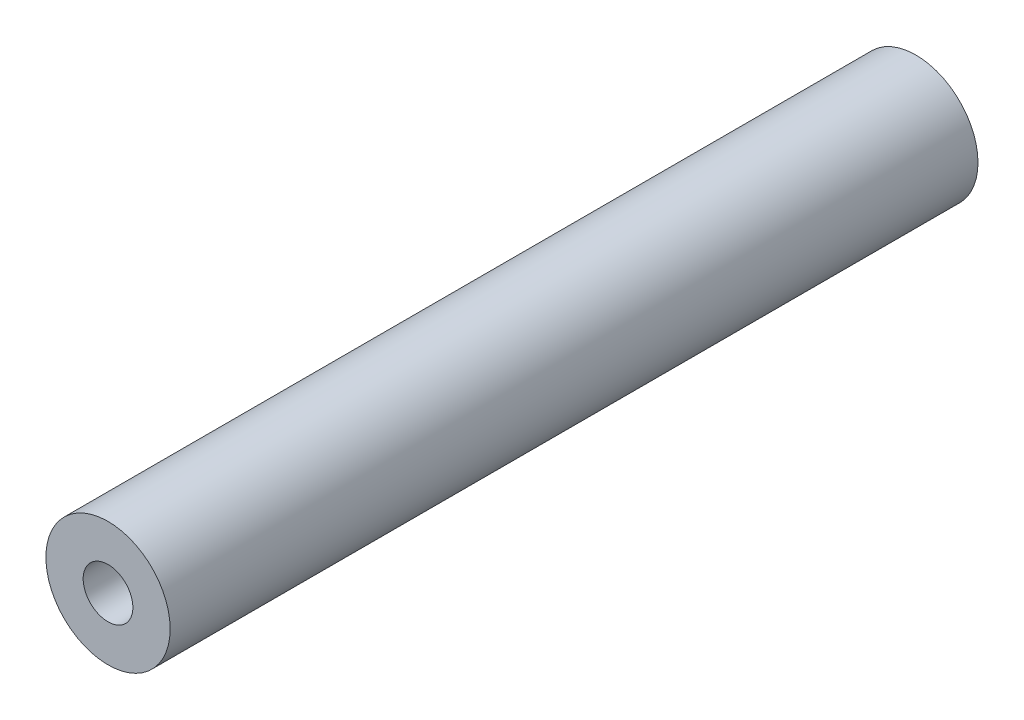
ISO-10303-21;
HEADER;
FILE_DESCRIPTION(('STEP AP214'),'2;1');
FILE_NAME('part.step','',(''),(''),'','','');
FILE_SCHEMA(('AUTOMOTIVE_DESIGN { 1 0 10303 214 1 1 1 1 }'));
ENDSEC;
DATA;
#1=APPLICATION_CONTEXT('core data for automotive mechanical design processes');
#2=APPLICATION_PROTOCOL_DEFINITION('international standard','automotive_design',2000,#1);
#3=PRODUCT_CONTEXT('',#1,'mechanical');
#4=PRODUCT('Part','Part','',(#3));
#5=PRODUCT_RELATED_PRODUCT_CATEGORY('part','',(#4));
#6=PRODUCT_DEFINITION_FORMATION('','',#4);
#7=PRODUCT_DEFINITION_CONTEXT('part definition',#1,'design');
#8=PRODUCT_DEFINITION('design','',#6,#7);
#9=PRODUCT_DEFINITION_SHAPE('','',#8);
#10=(LENGTH_UNIT() NAMED_UNIT(*) SI_UNIT(.MILLI.,.METRE.));
#11=(NAMED_UNIT(*) PLANE_ANGLE_UNIT() SI_UNIT($,.RADIAN.));
#12=(NAMED_UNIT(*) SI_UNIT($,.STERADIAN.) SOLID_ANGLE_UNIT());
#13=UNCERTAINTY_MEASURE_WITH_UNIT(LENGTH_MEASURE(1.E-05),#10,'distance_accuracy_value','');
#14=(GEOMETRIC_REPRESENTATION_CONTEXT(3) GLOBAL_UNCERTAINTY_ASSIGNED_CONTEXT((#13)) GLOBAL_UNIT_ASSIGNED_CONTEXT((#10,
#11,#12)) REPRESENTATION_CONTEXT('',''));
#15=CARTESIAN_POINT('',(0.,0.,0.));
#16=DIRECTION('',(0.,0.,1.));
#17=DIRECTION('',(1.,0.,0.));
#18=AXIS2_PLACEMENT_3D('',#15,#16,#17);
#19=CARTESIAN_POINT('',(0.,0.,65.));
#20=DIRECTION('',(0.,0.,1.));
#21=DIRECTION('',(1.,0.,0.));
#22=AXIS2_PLACEMENT_3D('',#19,#20,#21);
#23=PLANE('',#22);
#24=CARTESIAN_POINT('',(0.,0.,65.));
#25=DIRECTION('',(0.,0.,1.));
#26=DIRECTION('',(1.,0.,0.));
#27=AXIS2_PLACEMENT_3D('',#24,#25,#26);
#28=CIRCLE('',#27,5.);
#29=CARTESIAN_POINT('',(5.,0.,65.));
#30=VERTEX_POINT('',#29);
#31=EDGE_CURVE('E10',#30,#30,#28,.T.);
#32=ORIENTED_EDGE('',*,*,#31,.T.);
#33=EDGE_LOOP('',(#32));
#34=FACE_BOUND('',#33,.T.);
#35=CARTESIAN_POINT('',(0.,0.,65.));
#36=DIRECTION('',(0.,0.,1.));
#37=DIRECTION('',(1.,0.,0.));
#38=AXIS2_PLACEMENT_3D('',#35,#36,#37);
#39=CIRCLE('',#38,2.);
#40=CARTESIAN_POINT('',(2.,0.,65.));
#41=VERTEX_POINT('',#40);
#42=EDGE_CURVE('E42',#41,#41,#39,.T.);
#43=ORIENTED_EDGE('',*,*,#42,.F.);
#44=EDGE_LOOP('',(#43));
#45=FACE_BOUND('',#44,.T.);
#46=ADVANCED_FACE('F31',(#34,#45),#23,.T.);
#47=CARTESIAN_POINT('',(0.,0.,0.));
#48=DIRECTION('',(0.,0.,1.));
#49=DIRECTION('',(1.,0.,0.));
#50=AXIS2_PLACEMENT_3D('',#47,#48,#49);
#51=PLANE('',#50);
#52=CARTESIAN_POINT('',(0.,0.,0.));
#53=DIRECTION('',(0.,0.,1.));
#54=DIRECTION('',(1.,0.,0.));
#55=AXIS2_PLACEMENT_3D('',#52,#53,#54);
#56=CIRCLE('',#55,5.);
#57=CARTESIAN_POINT('',(5.,0.,0.));
#58=VERTEX_POINT('',#57);
#59=EDGE_CURVE('E35',#58,#58,#56,.T.);
#60=ORIENTED_EDGE('',*,*,#59,.F.);
#61=EDGE_LOOP('',(#60));
#62=FACE_BOUND('',#61,.T.);
#63=CARTESIAN_POINT('',(0.,0.,0.));
#64=DIRECTION('',(0.,0.,1.));
#65=DIRECTION('',(1.,0.,0.));
#66=AXIS2_PLACEMENT_3D('',#63,#64,#65);
#67=CIRCLE('',#66,2.);
#68=CARTESIAN_POINT('',(2.,0.,0.));
#69=VERTEX_POINT('',#68);
#70=EDGE_CURVE('E44',#69,#69,#67,.T.);
#71=ORIENTED_EDGE('',*,*,#70,.T.);
#72=EDGE_LOOP('',(#71));
#73=FACE_BOUND('',#72,.T.);
#74=ADVANCED_FACE('F54',(#62,#73),#51,.F.);
#75=CARTESIAN_POINT('',(0.,0.,65.));
#76=DIRECTION('',(0.,0.,-1.));
#77=DIRECTION('',(-1.,0.,0.));
#78=AXIS2_PLACEMENT_3D('',#75,#76,#77);
#79=CYLINDRICAL_SURFACE('',#78,5.);
#80=ORIENTED_EDGE('',*,*,#31,.F.);
#81=EDGE_LOOP('',(#80));
#82=FACE_BOUND('',#81,.T.);
#83=ORIENTED_EDGE('',*,*,#59,.T.);
#84=EDGE_LOOP('',(#83));
#85=FACE_BOUND('',#84,.T.);
#86=ADVANCED_FACE('F33',(#82,#85),#79,.T.);
#87=CARTESIAN_POINT('',(0.,0.,65.));
#88=DIRECTION('',(0.,0.,-1.));
#89=DIRECTION('',(-1.,0.,0.));
#90=AXIS2_PLACEMENT_3D('',#87,#88,#89);
#91=CYLINDRICAL_SURFACE('',#90,2.);
#92=ORIENTED_EDGE('',*,*,#42,.T.);
#93=EDGE_LOOP('',(#92));
#94=FACE_BOUND('',#93,.T.);
#95=ORIENTED_EDGE('',*,*,#70,.F.);
#96=EDGE_LOOP('',(#95));
#97=FACE_BOUND('',#96,.T.);
#98=ADVANCED_FACE('F50',(#94,#97),#91,.F.);
#99=CLOSED_SHELL('',(#46,#74,#86,#98));
#100=MANIFOLD_SOLID_BREP('B2',#99);
#101=ADVANCED_BREP_SHAPE_REPRESENTATION('',(#18,#100),#14);
#102=SHAPE_DEFINITION_REPRESENTATION(#9,#101);
ENDSEC;
END-ISO-10303-21;
